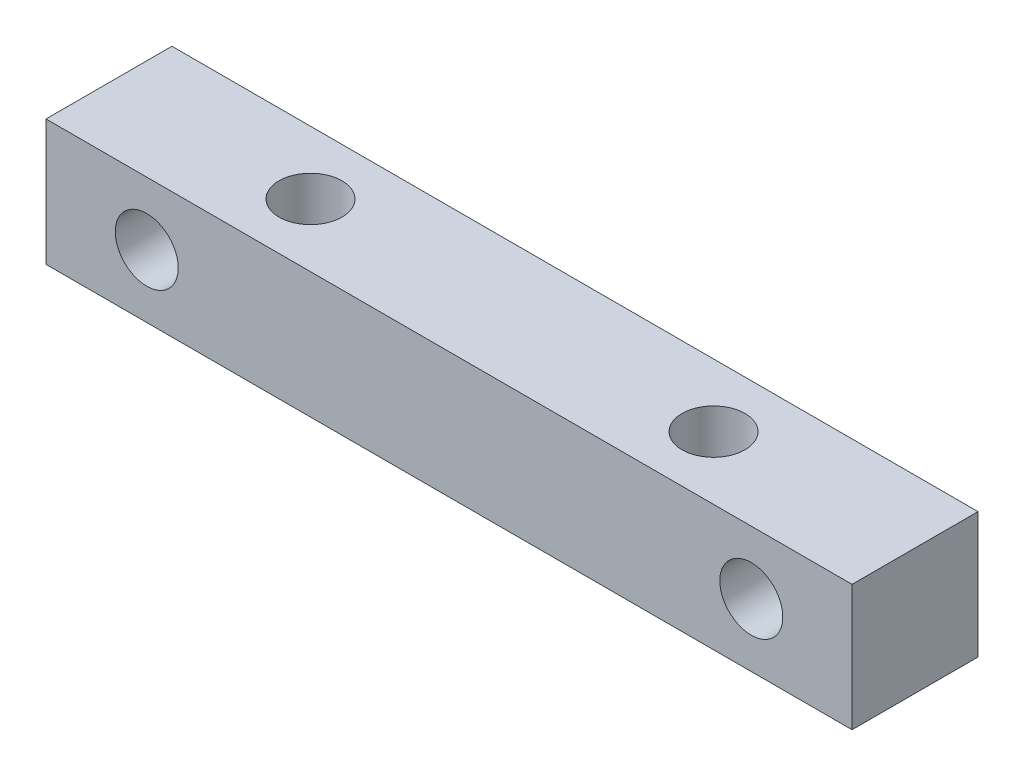
ISO-10303-21;
HEADER;
FILE_DESCRIPTION(('STEP AP214'),'2;1');
FILE_NAME('part.step','',(''),(''),'','','');
FILE_SCHEMA(('AUTOMOTIVE_DESIGN { 1 0 10303 214 1 1 1 1 }'));
ENDSEC;
DATA;
#1=APPLICATION_CONTEXT('core data for automotive mechanical design processes');
#2=APPLICATION_PROTOCOL_DEFINITION('international standard','automotive_design',2000,#1);
#3=PRODUCT_CONTEXT('',#1,'mechanical');
#4=PRODUCT('Part','Part','',(#3));
#5=PRODUCT_RELATED_PRODUCT_CATEGORY('part','',(#4));
#6=PRODUCT_DEFINITION_FORMATION('','',#4);
#7=PRODUCT_DEFINITION_CONTEXT('part definition',#1,'design');
#8=PRODUCT_DEFINITION('design','',#6,#7);
#9=PRODUCT_DEFINITION_SHAPE('','',#8);
#10=(LENGTH_UNIT() NAMED_UNIT(*) SI_UNIT(.MILLI.,.METRE.));
#11=(NAMED_UNIT(*) PLANE_ANGLE_UNIT() SI_UNIT($,.RADIAN.));
#12=(NAMED_UNIT(*) SI_UNIT($,.STERADIAN.) SOLID_ANGLE_UNIT());
#13=UNCERTAINTY_MEASURE_WITH_UNIT(LENGTH_MEASURE(1.E-05),#10,'distance_accuracy_value','');
#14=(GEOMETRIC_REPRESENTATION_CONTEXT(3) GLOBAL_UNCERTAINTY_ASSIGNED_CONTEXT((#13)) GLOBAL_UNIT_ASSIGNED_CONTEXT((#10,
#11,#12)) REPRESENTATION_CONTEXT('',''));
#15=CARTESIAN_POINT('',(0.,0.,0.));
#16=DIRECTION('',(0.,0.,1.));
#17=DIRECTION('',(1.,0.,0.));
#18=AXIS2_PLACEMENT_3D('',#15,#16,#17);
#19=CARTESIAN_POINT('',(-16.,2.5,5.));
#20=DIRECTION('',(1.,0.,0.));
#21=DIRECTION('',(0.,0.,-1.));
#22=AXIS2_PLACEMENT_3D('',#19,#20,#21);
#23=PLANE('',#22);
#24=DIRECTION('',(0.,-1.,0.));
#25=VECTOR('',#24,1.);
#26=CARTESIAN_POINT('',(-16.,2.5,0.));
#27=LINE('',#26,#25);
#28=CARTESIAN_POINT('',(-16.,2.5,0.));
#29=VERTEX_POINT('',#28);
#30=CARTESIAN_POINT('',(-16.,-2.5,0.));
#31=VERTEX_POINT('',#30);
#32=EDGE_CURVE('E80',#29,#31,#27,.T.);
#33=ORIENTED_EDGE('',*,*,#32,.T.);
#34=DIRECTION('',(0.,0.,-1.));
#35=VECTOR('',#34,1.);
#36=CARTESIAN_POINT('',(-16.,-2.5,5.));
#37=LINE('',#36,#35);
#38=CARTESIAN_POINT('',(-16.,-2.5,5.));
#39=VERTEX_POINT('',#38);
#40=EDGE_CURVE('E11',#39,#31,#37,.T.);
#41=ORIENTED_EDGE('',*,*,#40,.F.);
#42=DIRECTION('',(0.,-1.,0.));
#43=VECTOR('',#42,1.);
#44=CARTESIAN_POINT('',(-16.,2.5,5.));
#45=LINE('',#44,#43);
#46=CARTESIAN_POINT('',(-16.,2.5,5.));
#47=VERTEX_POINT('',#46);
#48=EDGE_CURVE('E68',#47,#39,#45,.T.);
#49=ORIENTED_EDGE('',*,*,#48,.F.);
#50=DIRECTION('',(0.,0.,-1.));
#51=VECTOR('',#50,1.);
#52=CARTESIAN_POINT('',(-16.,2.5,5.));
#53=LINE('',#52,#51);
#54=EDGE_CURVE('E76',#47,#29,#53,.T.);
#55=ORIENTED_EDGE('',*,*,#54,.T.);
#56=EDGE_LOOP('',(#33,#41,#49,#55));
#57=FACE_BOUND('',#56,.T.);
#58=ADVANCED_FACE('F17',(#57),#23,.F.);
#59=CARTESIAN_POINT('',(16.,-2.5,5.));
#60=DIRECTION('',(0.,1.,0.));
#61=DIRECTION('',(-1.,0.,0.));
#62=AXIS2_PLACEMENT_3D('',#59,#60,#61);
#63=PLANE('',#62);
#64=CARTESIAN_POINT('',(-8.,-2.5,2.5));
#65=DIRECTION('',(0.,1.,0.));
#66=DIRECTION('',(-1.,0.,0.));
#67=AXIS2_PLACEMENT_3D('',#64,#65,#66);
#68=CIRCLE('',#67,1.25);
#69=CARTESIAN_POINT('',(-9.25,-2.5,2.5));
#70=VERTEX_POINT('',#69);
#71=EDGE_CURVE('E83',#70,#70,#68,.T.);
#72=ORIENTED_EDGE('',*,*,#71,.T.);
#73=EDGE_LOOP('',(#72));
#74=FACE_BOUND('',#73,.T.);
#75=CARTESIAN_POINT('',(8.,-2.5,2.5));
#76=DIRECTION('',(0.,1.,0.));
#77=DIRECTION('',(-1.,0.,0.));
#78=AXIS2_PLACEMENT_3D('',#75,#76,#77);
#79=CIRCLE('',#78,1.25);
#80=CARTESIAN_POINT('',(6.75,-2.5,2.5));
#81=VERTEX_POINT('',#80);
#82=EDGE_CURVE('E96',#81,#81,#79,.T.);
#83=ORIENTED_EDGE('',*,*,#82,.T.);
#84=EDGE_LOOP('',(#83));
#85=FACE_BOUND('',#84,.T.);
#86=DIRECTION('',(1.,0.,0.));
#87=VECTOR('',#86,1.);
#88=CARTESIAN_POINT('',(16.,-2.5,0.));
#89=LINE('',#88,#87);
#90=CARTESIAN_POINT('',(16.,-2.5,0.));
#91=VERTEX_POINT('',#90);
#92=EDGE_CURVE('E72',#31,#91,#89,.T.);
#93=ORIENTED_EDGE('',*,*,#92,.T.);
#94=DIRECTION('',(0.,0.,-1.));
#95=VECTOR('',#94,1.);
#96=CARTESIAN_POINT('',(16.,-2.5,5.));
#97=LINE('',#96,#95);
#98=CARTESIAN_POINT('',(16.,-2.5,5.));
#99=VERTEX_POINT('',#98);
#100=EDGE_CURVE('E25',#99,#91,#97,.T.);
#101=ORIENTED_EDGE('',*,*,#100,.F.);
#102=DIRECTION('',(1.,0.,0.));
#103=VECTOR('',#102,1.);
#104=CARTESIAN_POINT('',(16.,-2.5,5.));
#105=LINE('',#104,#103);
#106=EDGE_CURVE('E63',#39,#99,#105,.T.);
#107=ORIENTED_EDGE('',*,*,#106,.F.);
#108=ORIENTED_EDGE('',*,*,#40,.T.);
#109=EDGE_LOOP('',(#93,#101,#107,#108));
#110=FACE_BOUND('',#109,.T.);
#111=ADVANCED_FACE('F71',(#74,#85,#110),#63,.F.);
#112=CARTESIAN_POINT('',(16.,2.5,5.));
#113=DIRECTION('',(-1.,0.,0.));
#114=DIRECTION('',(0.,0.,1.));
#115=AXIS2_PLACEMENT_3D('',#112,#113,#114);
#116=PLANE('',#115);
#117=DIRECTION('',(0.,1.,0.));
#118=VECTOR('',#117,1.);
#119=CARTESIAN_POINT('',(16.,2.5,0.));
#120=LINE('',#119,#118);
#121=CARTESIAN_POINT('',(16.,2.5,0.));
#122=VERTEX_POINT('',#121);
#123=EDGE_CURVE('E50',#91,#122,#120,.T.);
#124=ORIENTED_EDGE('',*,*,#123,.T.);
#125=DIRECTION('',(0.,0.,-1.));
#126=VECTOR('',#125,1.);
#127=CARTESIAN_POINT('',(16.,2.5,5.));
#128=LINE('',#127,#126);
#129=CARTESIAN_POINT('',(16.,2.5,5.));
#130=VERTEX_POINT('',#129);
#131=EDGE_CURVE('E73',#130,#122,#128,.T.);
#132=ORIENTED_EDGE('',*,*,#131,.F.);
#133=DIRECTION('',(0.,1.,0.));
#134=VECTOR('',#133,1.);
#135=CARTESIAN_POINT('',(16.,2.5,5.));
#136=LINE('',#135,#134);
#137=EDGE_CURVE('E66',#99,#130,#136,.T.);
#138=ORIENTED_EDGE('',*,*,#137,.F.);
#139=ORIENTED_EDGE('',*,*,#100,.T.);
#140=EDGE_LOOP('',(#124,#132,#138,#139));
#141=FACE_BOUND('',#140,.T.);
#142=ADVANCED_FACE('F74',(#141),#116,.F.);
#143=CARTESIAN_POINT('',(16.,2.5,5.));
#144=DIRECTION('',(0.,-1.,0.));
#145=DIRECTION('',(1.,0.,0.));
#146=AXIS2_PLACEMENT_3D('',#143,#144,#145);
#147=PLANE('',#146);
#148=CARTESIAN_POINT('',(-8.,2.5,2.5));
#149=DIRECTION('',(0.,1.,0.));
#150=DIRECTION('',(-1.,0.,0.));
#151=AXIS2_PLACEMENT_3D('',#148,#149,#150);
#152=CIRCLE('',#151,1.25);
#153=CARTESIAN_POINT('',(-9.25,2.5,2.5));
#154=VERTEX_POINT('',#153);
#155=EDGE_CURVE('E99',#154,#154,#152,.T.);
#156=ORIENTED_EDGE('',*,*,#155,.F.);
#157=EDGE_LOOP('',(#156));
#158=FACE_BOUND('',#157,.T.);
#159=CARTESIAN_POINT('',(8.,2.5,2.5));
#160=DIRECTION('',(0.,1.,0.));
#161=DIRECTION('',(-1.,0.,0.));
#162=AXIS2_PLACEMENT_3D('',#159,#160,#161);
#163=CIRCLE('',#162,1.25);
#164=CARTESIAN_POINT('',(6.75,2.5,2.5));
#165=VERTEX_POINT('',#164);
#166=EDGE_CURVE('E100',#165,#165,#163,.T.);
#167=ORIENTED_EDGE('',*,*,#166,.F.);
#168=EDGE_LOOP('',(#167));
#169=FACE_BOUND('',#168,.T.);
#170=DIRECTION('',(-1.,0.,0.));
#171=VECTOR('',#170,1.);
#172=CARTESIAN_POINT('',(16.,2.5,0.));
#173=LINE('',#172,#171);
#174=EDGE_CURVE('E56',#122,#29,#173,.T.);
#175=ORIENTED_EDGE('',*,*,#174,.T.);
#176=ORIENTED_EDGE('',*,*,#54,.F.);
#177=DIRECTION('',(-1.,0.,0.));
#178=VECTOR('',#177,1.);
#179=CARTESIAN_POINT('',(16.,2.5,5.));
#180=LINE('',#179,#178);
#181=EDGE_CURVE('E33',#130,#47,#180,.T.);
#182=ORIENTED_EDGE('',*,*,#181,.F.);
#183=ORIENTED_EDGE('',*,*,#131,.T.);
#184=EDGE_LOOP('',(#175,#176,#182,#183));
#185=FACE_BOUND('',#184,.T.);
#186=ADVANCED_FACE('F88',(#158,#169,#185),#147,.F.);
#187=CARTESIAN_POINT('',(0.,0.,5.));
#188=DIRECTION('',(0.,0.,-1.));
#189=DIRECTION('',(-1.,0.,0.));
#190=AXIS2_PLACEMENT_3D('',#187,#188,#189);
#191=PLANE('',#190);
#192=CARTESIAN_POINT('',(-12.,0.,5.));
#193=DIRECTION('',(0.,0.,-1.));
#194=DIRECTION('',(-1.,0.,0.));
#195=AXIS2_PLACEMENT_3D('',#192,#193,#194);
#196=CIRCLE('',#195,1.25);
#197=CARTESIAN_POINT('',(-13.25,0.,5.));
#198=VERTEX_POINT('',#197);
#199=EDGE_CURVE('E103',#198,#198,#196,.T.);
#200=ORIENTED_EDGE('',*,*,#199,.T.);
#201=EDGE_LOOP('',(#200));
#202=FACE_BOUND('',#201,.T.);
#203=CARTESIAN_POINT('',(12.,0.,5.));
#204=DIRECTION('',(0.,0.,-1.));
#205=DIRECTION('',(-1.,0.,0.));
#206=AXIS2_PLACEMENT_3D('',#203,#204,#205);
#207=CIRCLE('',#206,1.25);
#208=CARTESIAN_POINT('',(10.75,0.,5.));
#209=VERTEX_POINT('',#208);
#210=EDGE_CURVE('E109',#209,#209,#207,.T.);
#211=ORIENTED_EDGE('',*,*,#210,.T.);
#212=EDGE_LOOP('',(#211));
#213=FACE_BOUND('',#212,.T.);
#214=ORIENTED_EDGE('',*,*,#48,.T.);
#215=ORIENTED_EDGE('',*,*,#106,.T.);
#216=ORIENTED_EDGE('',*,*,#137,.T.);
#217=ORIENTED_EDGE('',*,*,#181,.T.);
#218=EDGE_LOOP('',(#214,#215,#216,#217));
#219=FACE_BOUND('',#218,.T.);
#220=ADVANCED_FACE('F64',(#202,#213,#219),#191,.F.);
#221=CARTESIAN_POINT('',(0.,0.,0.));
#222=DIRECTION('',(0.,0.,-1.));
#223=DIRECTION('',(-1.,0.,0.));
#224=AXIS2_PLACEMENT_3D('',#221,#222,#223);
#225=PLANE('',#224);
#226=CARTESIAN_POINT('',(-12.,0.,0.));
#227=DIRECTION('',(0.,0.,-1.));
#228=DIRECTION('',(-1.,0.,0.));
#229=AXIS2_PLACEMENT_3D('',#226,#227,#228);
#230=CIRCLE('',#229,1.25);
#231=CARTESIAN_POINT('',(-13.25,0.,0.));
#232=VERTEX_POINT('',#231);
#233=EDGE_CURVE('E112',#232,#232,#230,.T.);
#234=ORIENTED_EDGE('',*,*,#233,.F.);
#235=EDGE_LOOP('',(#234));
#236=FACE_BOUND('',#235,.T.);
#237=CARTESIAN_POINT('',(12.,0.,0.));
#238=DIRECTION('',(0.,0.,-1.));
#239=DIRECTION('',(-1.,0.,0.));
#240=AXIS2_PLACEMENT_3D('',#237,#238,#239);
#241=CIRCLE('',#240,1.25);
#242=CARTESIAN_POINT('',(10.75,0.,0.));
#243=VERTEX_POINT('',#242);
#244=EDGE_CURVE('E106',#243,#243,#241,.T.);
#245=ORIENTED_EDGE('',*,*,#244,.F.);
#246=EDGE_LOOP('',(#245));
#247=FACE_BOUND('',#246,.T.);
#248=ORIENTED_EDGE('',*,*,#32,.F.);
#249=ORIENTED_EDGE('',*,*,#174,.F.);
#250=ORIENTED_EDGE('',*,*,#123,.F.);
#251=ORIENTED_EDGE('',*,*,#92,.F.);
#252=EDGE_LOOP('',(#248,#249,#250,#251));
#253=FACE_BOUND('',#252,.T.);
#254=ADVANCED_FACE('F91',(#236,#247,#253),#225,.T.);
#255=CARTESIAN_POINT('',(8.,-7.5,2.5));
#256=DIRECTION('',(0.,1.,0.));
#257=DIRECTION('',(-1.,0.,0.));
#258=AXIS2_PLACEMENT_3D('',#255,#256,#257);
#259=CYLINDRICAL_SURFACE('',#258,1.25);
#260=ORIENTED_EDGE('',*,*,#166,.T.);
#261=EDGE_LOOP('',(#260));
#262=FACE_BOUND('',#261,.T.);
#263=ORIENTED_EDGE('',*,*,#82,.F.);
#264=EDGE_LOOP('',(#263));
#265=FACE_BOUND('',#264,.T.);
#266=ADVANCED_FACE('F129',(#262,#265),#259,.F.);
#267=CARTESIAN_POINT('',(-8.,-7.5,2.5));
#268=DIRECTION('',(0.,1.,0.));
#269=DIRECTION('',(-1.,0.,0.));
#270=AXIS2_PLACEMENT_3D('',#267,#268,#269);
#271=CYLINDRICAL_SURFACE('',#270,1.25);
#272=ORIENTED_EDGE('',*,*,#155,.T.);
#273=EDGE_LOOP('',(#272));
#274=FACE_BOUND('',#273,.T.);
#275=ORIENTED_EDGE('',*,*,#71,.F.);
#276=EDGE_LOOP('',(#275));
#277=FACE_BOUND('',#276,.T.);
#278=ADVANCED_FACE('F134',(#274,#277),#271,.F.);
#279=CARTESIAN_POINT('',(12.,0.,5.));
#280=DIRECTION('',(0.,0.,-1.));
#281=DIRECTION('',(-1.,0.,0.));
#282=AXIS2_PLACEMENT_3D('',#279,#280,#281);
#283=CYLINDRICAL_SURFACE('',#282,1.25);
#284=ORIENTED_EDGE('',*,*,#210,.F.);
#285=EDGE_LOOP('',(#284));
#286=FACE_BOUND('',#285,.T.);
#287=ORIENTED_EDGE('',*,*,#244,.T.);
#288=EDGE_LOOP('',(#287));
#289=FACE_BOUND('',#288,.T.);
#290=ADVANCED_FACE('F123',(#286,#289),#283,.F.);
#291=CARTESIAN_POINT('',(-12.,0.,5.));
#292=DIRECTION('',(0.,0.,-1.));
#293=DIRECTION('',(-1.,0.,0.));
#294=AXIS2_PLACEMENT_3D('',#291,#292,#293);
#295=CYLINDRICAL_SURFACE('',#294,1.25);
#296=ORIENTED_EDGE('',*,*,#199,.F.);
#297=EDGE_LOOP('',(#296));
#298=FACE_BOUND('',#297,.T.);
#299=ORIENTED_EDGE('',*,*,#233,.T.);
#300=EDGE_LOOP('',(#299));
#301=FACE_BOUND('',#300,.T.);
#302=ADVANCED_FACE('F120',(#298,#301),#295,.F.);
#303=CLOSED_SHELL('',(#58,#111,#142,#186,#220,#254,#266,#278,#290,#302));
#304=MANIFOLD_SOLID_BREP('B1',#303);
#305=ADVANCED_BREP_SHAPE_REPRESENTATION('',(#18,#304),#14);
#306=SHAPE_DEFINITION_REPRESENTATION(#9,#305);
ENDSEC;
END-ISO-10303-21;
